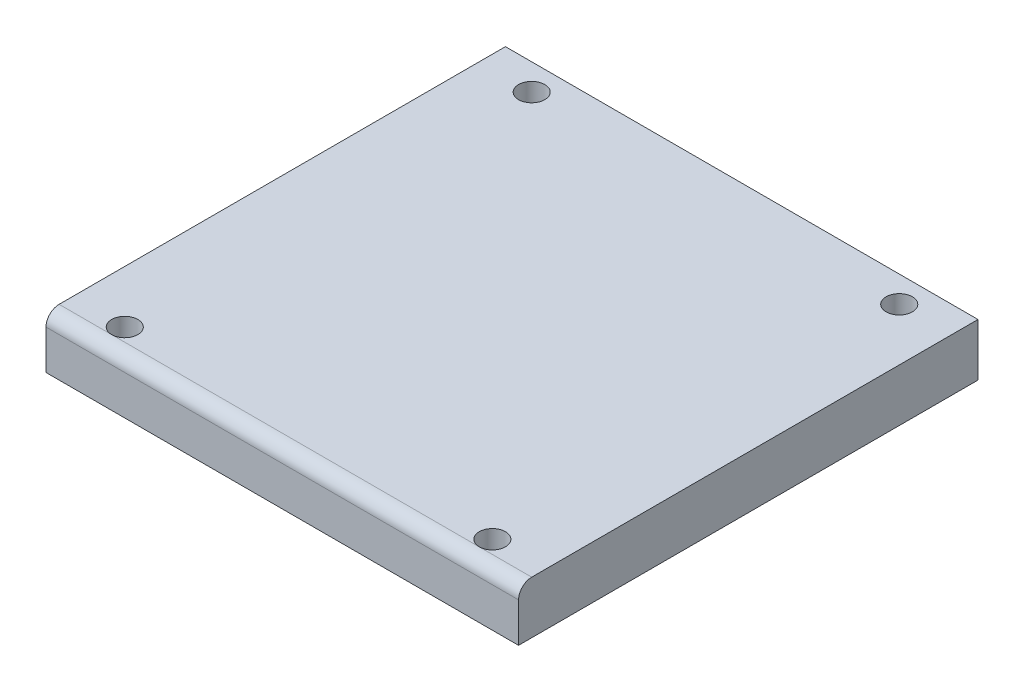
ISO-10303-21;
HEADER;
FILE_DESCRIPTION(('STEP AP214'),'2;1');
FILE_NAME('part.step','',(''),(''),'','','');
FILE_SCHEMA(('AUTOMOTIVE_DESIGN { 1 0 10303 214 1 1 1 1 }'));
ENDSEC;
DATA;
#1=APPLICATION_CONTEXT('core data for automotive mechanical design processes');
#2=APPLICATION_PROTOCOL_DEFINITION('international standard','automotive_design',2000,#1);
#3=PRODUCT_CONTEXT('',#1,'mechanical');
#4=PRODUCT('Part','Part','',(#3));
#5=PRODUCT_RELATED_PRODUCT_CATEGORY('part','',(#4));
#6=PRODUCT_DEFINITION_FORMATION('','',#4);
#7=PRODUCT_DEFINITION_CONTEXT('part definition',#1,'design');
#8=PRODUCT_DEFINITION('design','',#6,#7);
#9=PRODUCT_DEFINITION_SHAPE('','',#8);
#10=(LENGTH_UNIT() NAMED_UNIT(*) SI_UNIT(.MILLI.,.METRE.));
#11=(NAMED_UNIT(*) PLANE_ANGLE_UNIT() SI_UNIT($,.RADIAN.));
#12=(NAMED_UNIT(*) SI_UNIT($,.STERADIAN.) SOLID_ANGLE_UNIT());
#13=UNCERTAINTY_MEASURE_WITH_UNIT(LENGTH_MEASURE(1.E-05),#10,'distance_accuracy_value','');
#14=(GEOMETRIC_REPRESENTATION_CONTEXT(3) GLOBAL_UNCERTAINTY_ASSIGNED_CONTEXT((#13)) GLOBAL_UNIT_ASSIGNED_CONTEXT((#10,
#11,#12)) REPRESENTATION_CONTEXT('',''));
#15=CARTESIAN_POINT('',(0.,0.,0.));
#16=DIRECTION('',(0.,0.,1.));
#17=DIRECTION('',(1.,0.,0.));
#18=AXIS2_PLACEMENT_3D('',#15,#16,#17);
#19=CARTESIAN_POINT('',(0.,3.,0.));
#20=DIRECTION('',(0.,1.,0.));
#21=DIRECTION('',(0.,0.,1.));
#22=AXIS2_PLACEMENT_3D('',#19,#20,#21);
#23=PLANE('',#22);
#24=CARTESIAN_POINT('',(70.,3.,-77.5));
#25=DIRECTION('',(0.,1.,0.));
#26=DIRECTION('',(0.,0.,1.));
#27=AXIS2_PLACEMENT_3D('',#24,#25,#26);
#28=CIRCLE('',#27,2.75000000000001);
#29=CARTESIAN_POINT('',(70.,3.,-74.75));
#30=VERTEX_POINT('',#29);
#31=EDGE_CURVE('E159',#30,#30,#28,.F.);
#32=ORIENTED_EDGE('',*,*,#31,.T.);
#33=EDGE_LOOP('',(#32));
#34=FACE_BOUND('',#33,.T.);
#35=CARTESIAN_POINT('',(70.,3.,-77.5));
#36=DIRECTION('',(0.,1.,0.));
#37=DIRECTION('',(0.,0.,1.));
#38=AXIS2_PLACEMENT_3D('',#35,#36,#37);
#39=CIRCLE('',#38,5.00000000000001);
#40=CARTESIAN_POINT('',(70.,3.,-72.5));
#41=VERTEX_POINT('',#40);
#42=EDGE_CURVE('E140',#41,#41,#39,.T.);
#43=ORIENTED_EDGE('',*,*,#42,.T.);
#44=EDGE_LOOP('',(#43));
#45=FACE_BOUND('',#44,.T.);
#46=ADVANCED_FACE('F47',(#34,#45),#23,.T.);
#47=CARTESIAN_POINT('',(-70.,3.,77.5));
#48=DIRECTION('',(0.,1.,0.));
#49=DIRECTION('',(0.,0.,1.));
#50=AXIS2_PLACEMENT_3D('',#47,#48,#49);
#51=CIRCLE('',#50,5.00000000000001);
#52=CARTESIAN_POINT('',(-70.,3.,82.5));
#53=VERTEX_POINT('',#52);
#54=EDGE_CURVE('E145',#53,#53,#51,.F.);
#55=ORIENTED_EDGE('',*,*,#54,.F.);
#56=EDGE_LOOP('',(#55));
#57=FACE_BOUND('',#56,.T.);
#58=CARTESIAN_POINT('',(-70.,3.,77.5));
#59=DIRECTION('',(0.,1.,0.));
#60=DIRECTION('',(0.,0.,1.));
#61=AXIS2_PLACEMENT_3D('',#58,#59,#60);
#62=CIRCLE('',#61,2.75000000000001);
#63=CARTESIAN_POINT('',(-70.,3.,80.25));
#64=VERTEX_POINT('',#63);
#65=EDGE_CURVE('E164',#64,#64,#62,.T.);
#66=ORIENTED_EDGE('',*,*,#65,.F.);
#67=EDGE_LOOP('',(#66));
#68=FACE_BOUND('',#67,.T.);
#69=ADVANCED_FACE('F265',(#57,#68),#23,.T.);
#70=CARTESIAN_POINT('',(-70.,3.,-77.5));
#71=DIRECTION('',(0.,1.,0.));
#72=DIRECTION('',(0.,0.,1.));
#73=AXIS2_PLACEMENT_3D('',#70,#71,#72);
#74=CIRCLE('',#73,2.75000000000001);
#75=CARTESIAN_POINT('',(-70.,3.,-74.75));
#76=VERTEX_POINT('',#75);
#77=EDGE_CURVE('E155',#76,#76,#74,.F.);
#78=ORIENTED_EDGE('',*,*,#77,.T.);
#79=EDGE_LOOP('',(#78));
#80=FACE_BOUND('',#79,.T.);
#81=CARTESIAN_POINT('',(-70.,3.,-77.5));
#82=DIRECTION('',(0.,1.,0.));
#83=DIRECTION('',(0.,0.,1.));
#84=AXIS2_PLACEMENT_3D('',#81,#82,#83);
#85=CIRCLE('',#84,5.00000000000001);
#86=CARTESIAN_POINT('',(-70.,3.,-72.5));
#87=VERTEX_POINT('',#86);
#88=EDGE_CURVE('E136',#87,#87,#85,.T.);
#89=ORIENTED_EDGE('',*,*,#88,.T.);
#90=EDGE_LOOP('',(#89));
#91=FACE_BOUND('',#90,.T.);
#92=ADVANCED_FACE('F272',(#80,#91),#23,.T.);
#93=CARTESIAN_POINT('',(-90.,3.,0.));
#94=DIRECTION('',(-1.,0.,0.));
#95=DIRECTION('',(0.,0.,1.));
#96=AXIS2_PLACEMENT_3D('',#93,#94,#95);
#97=PLANE('',#96);
#98=DIRECTION('',(0.,-1.,0.));
#99=VECTOR('',#98,1.);
#100=CARTESIAN_POINT('',(-90.,3.,87.5000000000001));
#101=LINE('',#100,#99);
#102=CARTESIAN_POINT('',(-90.,15.,87.5000000000001));
#103=VERTEX_POINT('',#102);
#104=CARTESIAN_POINT('',(-90.,0.,87.5000000000001));
#105=VERTEX_POINT('',#104);
#106=EDGE_CURVE('E146',#103,#105,#101,.T.);
#107=ORIENTED_EDGE('',*,*,#106,.F.);
#108=CARTESIAN_POINT('',(-90.,15.,82.5));
#109=DIRECTION('',(-1.,0.,0.));
#110=DIRECTION('',(0.,0.,1.));
#111=AXIS2_PLACEMENT_3D('',#108,#109,#110);
#112=CIRCLE('',#111,5.);
#113=CARTESIAN_POINT('',(-90.,20.,82.5));
#114=VERTEX_POINT('',#113);
#115=EDGE_CURVE('E208',#103,#114,#112,.T.);
#116=ORIENTED_EDGE('',*,*,#115,.T.);
#117=DIRECTION('',(0.,0.,-1.));
#118=VECTOR('',#117,1.);
#119=CARTESIAN_POINT('',(-90.,20.,0.));
#120=LINE('',#119,#118);
#121=CARTESIAN_POINT('',(-90.,20.,-87.5));
#122=VERTEX_POINT('',#121);
#123=EDGE_CURVE('E108',#114,#122,#120,.T.);
#124=ORIENTED_EDGE('',*,*,#123,.T.);
#125=DIRECTION('',(0.,-1.,0.));
#126=VECTOR('',#125,1.);
#127=CARTESIAN_POINT('',(-90.,3.,-87.5));
#128=LINE('',#127,#126);
#129=CARTESIAN_POINT('',(-90.,0.,-87.5));
#130=VERTEX_POINT('',#129);
#131=EDGE_CURVE('E120',#122,#130,#128,.T.);
#132=ORIENTED_EDGE('',*,*,#131,.T.);
#133=DIRECTION('',(0.,0.,-1.));
#134=VECTOR('',#133,1.);
#135=CARTESIAN_POINT('',(-90.,0.,0.));
#136=LINE('',#135,#134);
#137=EDGE_CURVE('E154',#105,#130,#136,.T.);
#138=ORIENTED_EDGE('',*,*,#137,.F.);
#139=EDGE_LOOP('',(#107,#116,#124,#132,#138));
#140=FACE_BOUND('',#139,.T.);
#141=ADVANCED_FACE('F230',(#140),#97,.T.);
#142=CARTESIAN_POINT('',(0.,3.,87.5));
#143=DIRECTION('',(0.,0.,1.));
#144=DIRECTION('',(1.,0.,0.));
#145=AXIS2_PLACEMENT_3D('',#142,#143,#144);
#146=PLANE('',#145);
#147=DIRECTION('',(0.,-1.,0.));
#148=VECTOR('',#147,1.);
#149=CARTESIAN_POINT('',(90.,3.,87.5));
#150=LINE('',#149,#148);
#151=CARTESIAN_POINT('',(90.,15.,87.5));
#152=VERTEX_POINT('',#151);
#153=CARTESIAN_POINT('',(90.,0.,87.5));
#154=VERTEX_POINT('',#153);
#155=EDGE_CURVE('E119',#152,#154,#150,.T.);
#156=ORIENTED_EDGE('',*,*,#155,.F.);
#157=DIRECTION('',(-1.,0.,0.));
#158=VECTOR('',#157,1.);
#159=CARTESIAN_POINT('',(0.,15.,87.5));
#160=LINE('',#159,#158);
#161=EDGE_CURVE('E150',#152,#103,#160,.T.);
#162=ORIENTED_EDGE('',*,*,#161,.T.);
#163=ORIENTED_EDGE('',*,*,#106,.T.);
#164=DIRECTION('',(-1.,0.,0.));
#165=VECTOR('',#164,1.);
#166=CARTESIAN_POINT('',(0.,0.,87.5));
#167=LINE('',#166,#165);
#168=EDGE_CURVE('E175',#154,#105,#167,.T.);
#169=ORIENTED_EDGE('',*,*,#168,.F.);
#170=EDGE_LOOP('',(#156,#162,#163,#169));
#171=FACE_BOUND('',#170,.T.);
#172=ADVANCED_FACE('F235',(#171),#146,.T.);
#173=CARTESIAN_POINT('',(90.,3.,0.));
#174=DIRECTION('',(-1.,0.,0.));
#175=DIRECTION('',(0.,0.,1.));
#176=AXIS2_PLACEMENT_3D('',#173,#174,#175);
#177=PLANE('',#176);
#178=DIRECTION('',(0.,0.,-1.));
#179=VECTOR('',#178,1.);
#180=CARTESIAN_POINT('',(90.,20.,0.));
#181=LINE('',#180,#179);
#182=CARTESIAN_POINT('',(90.,20.,82.5));
#183=VERTEX_POINT('',#182);
#184=CARTESIAN_POINT('',(90.,20.,-87.5));
#185=VERTEX_POINT('',#184);
#186=EDGE_CURVE('E99',#183,#185,#181,.T.);
#187=ORIENTED_EDGE('',*,*,#186,.F.);
#188=CARTESIAN_POINT('',(90.,15.,82.5));
#189=DIRECTION('',(-1.,0.,0.));
#190=DIRECTION('',(0.,0.,1.));
#191=AXIS2_PLACEMENT_3D('',#188,#189,#190);
#192=CIRCLE('',#191,5.);
#193=EDGE_CURVE('E11',#183,#152,#192,.F.);
#194=ORIENTED_EDGE('',*,*,#193,.T.);
#195=ORIENTED_EDGE('',*,*,#155,.T.);
#196=DIRECTION('',(0.,0.,-1.));
#197=VECTOR('',#196,1.);
#198=CARTESIAN_POINT('',(90.,0.,0.));
#199=LINE('',#198,#197);
#200=CARTESIAN_POINT('',(90.,0.,-87.5));
#201=VERTEX_POINT('',#200);
#202=EDGE_CURVE('E114',#154,#201,#199,.T.);
#203=ORIENTED_EDGE('',*,*,#202,.T.);
#204=DIRECTION('',(0.,-1.,0.));
#205=VECTOR('',#204,1.);
#206=CARTESIAN_POINT('',(90.,3.,-87.5));
#207=LINE('',#206,#205);
#208=EDGE_CURVE('E111',#185,#201,#207,.T.);
#209=ORIENTED_EDGE('',*,*,#208,.F.);
#210=EDGE_LOOP('',(#187,#194,#195,#203,#209));
#211=FACE_BOUND('',#210,.T.);
#212=ADVANCED_FACE('F112',(#211),#177,.F.);
#213=CARTESIAN_POINT('',(-70.,3.,77.5));
#214=DIRECTION('',(0.,-1.,0.));
#215=DIRECTION('',(0.,0.,-1.));
#216=AXIS2_PLACEMENT_3D('',#213,#214,#215);
#217=CYLINDRICAL_SURFACE('',#216,2.75000000000001);
#218=ORIENTED_EDGE('',*,*,#65,.T.);
#219=EDGE_LOOP('',(#218));
#220=FACE_BOUND('',#219,.T.);
#221=CARTESIAN_POINT('',(-70.,0.,77.5));
#222=DIRECTION('',(0.,1.,0.));
#223=DIRECTION('',(0.,0.,1.));
#224=AXIS2_PLACEMENT_3D('',#221,#222,#223);
#225=CIRCLE('',#224,2.75000000000001);
#226=CARTESIAN_POINT('',(-70.,0.,80.25));
#227=VERTEX_POINT('',#226);
#228=EDGE_CURVE('E192',#227,#227,#225,.T.);
#229=ORIENTED_EDGE('',*,*,#228,.F.);
#230=EDGE_LOOP('',(#229));
#231=FACE_BOUND('',#230,.T.);
#232=ADVANCED_FACE('F252',(#220,#231),#217,.F.);
#233=CARTESIAN_POINT('',(70.,3.,-77.5));
#234=DIRECTION('',(0.,-1.,0.));
#235=DIRECTION('',(0.,0.,-1.));
#236=AXIS2_PLACEMENT_3D('',#233,#234,#235);
#237=CYLINDRICAL_SURFACE('',#236,2.75000000000001);
#238=ORIENTED_EDGE('',*,*,#31,.F.);
#239=EDGE_LOOP('',(#238));
#240=FACE_BOUND('',#239,.T.);
#241=CARTESIAN_POINT('',(70.,0.,-77.5));
#242=DIRECTION('',(0.,1.,0.));
#243=DIRECTION('',(0.,0.,1.));
#244=AXIS2_PLACEMENT_3D('',#241,#242,#243);
#245=CIRCLE('',#244,2.75000000000001);
#246=CARTESIAN_POINT('',(70.,0.,-74.75));
#247=VERTEX_POINT('',#246);
#248=EDGE_CURVE('E188',#247,#247,#245,.F.);
#249=ORIENTED_EDGE('',*,*,#248,.T.);
#250=EDGE_LOOP('',(#249));
#251=FACE_BOUND('',#250,.T.);
#252=ADVANCED_FACE('F249',(#240,#251),#237,.F.);
#253=CARTESIAN_POINT('',(-70.,3.,-77.5));
#254=DIRECTION('',(0.,-1.,0.));
#255=DIRECTION('',(0.,0.,-1.));
#256=AXIS2_PLACEMENT_3D('',#253,#254,#255);
#257=CYLINDRICAL_SURFACE('',#256,2.75000000000001);
#258=ORIENTED_EDGE('',*,*,#77,.F.);
#259=EDGE_LOOP('',(#258));
#260=FACE_BOUND('',#259,.T.);
#261=CARTESIAN_POINT('',(-70.,0.,-77.5));
#262=DIRECTION('',(0.,1.,0.));
#263=DIRECTION('',(0.,0.,1.));
#264=AXIS2_PLACEMENT_3D('',#261,#262,#263);
#265=CIRCLE('',#264,2.75000000000001);
#266=CARTESIAN_POINT('',(-70.,0.,-74.75));
#267=VERTEX_POINT('',#266);
#268=EDGE_CURVE('E184',#267,#267,#265,.F.);
#269=ORIENTED_EDGE('',*,*,#268,.T.);
#270=EDGE_LOOP('',(#269));
#271=FACE_BOUND('',#270,.T.);
#272=ADVANCED_FACE('F251',(#260,#271),#257,.F.);
#273=CARTESIAN_POINT('',(0.,3.,-87.5));
#274=DIRECTION('',(0.,0.,1.));
#275=DIRECTION('',(1.,0.,0.));
#276=AXIS2_PLACEMENT_3D('',#273,#274,#275);
#277=PLANE('',#276);
#278=DIRECTION('',(-1.,0.,0.));
#279=VECTOR('',#278,1.);
#280=CARTESIAN_POINT('',(0.,0.,-87.5));
#281=LINE('',#280,#279);
#282=EDGE_CURVE('E181',#201,#130,#281,.T.);
#283=ORIENTED_EDGE('',*,*,#282,.T.);
#284=ORIENTED_EDGE('',*,*,#131,.F.);
#285=DIRECTION('',(-1.,0.,0.));
#286=VECTOR('',#285,1.);
#287=CARTESIAN_POINT('',(0.,20.,-87.5));
#288=LINE('',#287,#286);
#289=EDGE_CURVE('E104',#185,#122,#288,.T.);
#290=ORIENTED_EDGE('',*,*,#289,.F.);
#291=ORIENTED_EDGE('',*,*,#208,.T.);
#292=EDGE_LOOP('',(#283,#284,#290,#291));
#293=FACE_BOUND('',#292,.T.);
#294=ADVANCED_FACE('F123',(#293),#277,.F.);
#295=CARTESIAN_POINT('',(70.,3.,77.5));
#296=DIRECTION('',(0.,-1.,0.));
#297=DIRECTION('',(0.,0.,-1.));
#298=AXIS2_PLACEMENT_3D('',#295,#296,#297);
#299=CYLINDRICAL_SURFACE('',#298,2.75000000000001);
#300=CARTESIAN_POINT('',(70.,3.,77.5));
#301=DIRECTION('',(0.,1.,0.));
#302=DIRECTION('',(0.,0.,1.));
#303=AXIS2_PLACEMENT_3D('',#300,#301,#302);
#304=CIRCLE('',#303,2.75000000000001);
#305=CARTESIAN_POINT('',(70.,3.,80.25));
#306=VERTEX_POINT('',#305);
#307=EDGE_CURVE('E168',#306,#306,#304,.T.);
#308=ORIENTED_EDGE('',*,*,#307,.T.);
#309=EDGE_LOOP('',(#308));
#310=FACE_BOUND('',#309,.T.);
#311=CARTESIAN_POINT('',(70.,0.,77.5));
#312=DIRECTION('',(0.,1.,0.));
#313=DIRECTION('',(0.,0.,1.));
#314=AXIS2_PLACEMENT_3D('',#311,#312,#313);
#315=CIRCLE('',#314,2.75000000000001);
#316=CARTESIAN_POINT('',(70.,0.,80.25));
#317=VERTEX_POINT('',#316);
#318=EDGE_CURVE('E160',#317,#317,#315,.T.);
#319=ORIENTED_EDGE('',*,*,#318,.F.);
#320=EDGE_LOOP('',(#319));
#321=FACE_BOUND('',#320,.T.);
#322=ADVANCED_FACE('F277',(#310,#321),#299,.F.);
#323=CARTESIAN_POINT('',(70.,3.,77.5));
#324=DIRECTION('',(0.,1.,0.));
#325=DIRECTION('',(0.,0.,1.));
#326=AXIS2_PLACEMENT_3D('',#323,#324,#325);
#327=CIRCLE('',#326,5.00000000000001);
#328=CARTESIAN_POINT('',(70.,3.,82.5));
#329=VERTEX_POINT('',#328);
#330=EDGE_CURVE('E141',#329,#329,#327,.F.);
#331=ORIENTED_EDGE('',*,*,#330,.F.);
#332=EDGE_LOOP('',(#331));
#333=FACE_BOUND('',#332,.T.);
#334=ORIENTED_EDGE('',*,*,#307,.F.);
#335=EDGE_LOOP('',(#334));
#336=FACE_BOUND('',#335,.T.);
#337=ADVANCED_FACE('F242',(#333,#336),#23,.T.);
#338=CARTESIAN_POINT('',(0.,0.,0.));
#339=DIRECTION('',(0.,1.,0.));
#340=DIRECTION('',(0.,0.,1.));
#341=AXIS2_PLACEMENT_3D('',#338,#339,#340);
#342=PLANE('',#341);
#343=ORIENTED_EDGE('',*,*,#318,.T.);
#344=EDGE_LOOP('',(#343));
#345=FACE_BOUND('',#344,.T.);
#346=ORIENTED_EDGE('',*,*,#268,.F.);
#347=EDGE_LOOP('',(#346));
#348=FACE_BOUND('',#347,.T.);
#349=ORIENTED_EDGE('',*,*,#137,.T.);
#350=ORIENTED_EDGE('',*,*,#282,.F.);
#351=ORIENTED_EDGE('',*,*,#202,.F.);
#352=ORIENTED_EDGE('',*,*,#168,.T.);
#353=EDGE_LOOP('',(#349,#350,#351,#352));
#354=FACE_BOUND('',#353,.T.);
#355=ORIENTED_EDGE('',*,*,#228,.T.);
#356=EDGE_LOOP('',(#355));
#357=FACE_BOUND('',#356,.T.);
#358=ORIENTED_EDGE('',*,*,#248,.F.);
#359=EDGE_LOOP('',(#358));
#360=FACE_BOUND('',#359,.T.);
#361=ADVANCED_FACE('F238',(#345,#348,#354,#357,#360),#342,.F.);
#362=CARTESIAN_POINT('',(70.,20.,-77.5));
#363=DIRECTION('',(0.,-1.,0.));
#364=DIRECTION('',(0.,0.,-1.));
#365=AXIS2_PLACEMENT_3D('',#362,#363,#364);
#366=CYLINDRICAL_SURFACE('',#365,5.00000000000001);
#367=ORIENTED_EDGE('',*,*,#42,.F.);
#368=EDGE_LOOP('',(#367));
#369=FACE_BOUND('',#368,.T.);
#370=CARTESIAN_POINT('',(70.,20.,-77.5));
#371=DIRECTION('',(0.,1.,0.));
#372=DIRECTION('',(0.,0.,1.));
#373=AXIS2_PLACEMENT_3D('',#370,#371,#372);
#374=CIRCLE('',#373,5.00000000000001);
#375=CARTESIAN_POINT('',(70.,20.,-72.5));
#376=VERTEX_POINT('',#375);
#377=EDGE_CURVE('E125',#376,#376,#374,.F.);
#378=ORIENTED_EDGE('',*,*,#377,.F.);
#379=EDGE_LOOP('',(#378));
#380=FACE_BOUND('',#379,.T.);
#381=ADVANCED_FACE('F241',(#369,#380),#366,.F.);
#382=CARTESIAN_POINT('',(-70.,20.,77.5));
#383=DIRECTION('',(0.,-1.,0.));
#384=DIRECTION('',(0.,0.,-1.));
#385=AXIS2_PLACEMENT_3D('',#382,#383,#384);
#386=CYLINDRICAL_SURFACE('',#385,5.00000000000001);
#387=ORIENTED_EDGE('',*,*,#54,.T.);
#388=EDGE_LOOP('',(#387));
#389=FACE_BOUND('',#388,.T.);
#390=CARTESIAN_POINT('',(-70.,20.,77.5));
#391=DIRECTION('',(0.,1.,0.));
#392=DIRECTION('',(0.,0.,1.));
#393=AXIS2_PLACEMENT_3D('',#390,#391,#392);
#394=CIRCLE('',#393,5.00000000000001);
#395=CARTESIAN_POINT('',(-70.,20.,82.5));
#396=VERTEX_POINT('',#395);
#397=EDGE_CURVE('E219',#396,#396,#394,.T.);
#398=ORIENTED_EDGE('',*,*,#397,.T.);
#399=EDGE_LOOP('',(#398));
#400=FACE_BOUND('',#399,.T.);
#401=ADVANCED_FACE('F310',(#389,#400),#386,.F.);
#402=CARTESIAN_POINT('',(70.,20.,77.5));
#403=DIRECTION('',(0.,-1.,0.));
#404=DIRECTION('',(0.,0.,-1.));
#405=AXIS2_PLACEMENT_3D('',#402,#403,#404);
#406=CYLINDRICAL_SURFACE('',#405,5.00000000000001);
#407=ORIENTED_EDGE('',*,*,#330,.T.);
#408=EDGE_LOOP('',(#407));
#409=FACE_BOUND('',#408,.T.);
#410=CARTESIAN_POINT('',(70.,20.,77.5));
#411=DIRECTION('',(0.,1.,0.));
#412=DIRECTION('',(0.,0.,1.));
#413=AXIS2_PLACEMENT_3D('',#410,#411,#412);
#414=CIRCLE('',#413,5.00000000000001);
#415=CARTESIAN_POINT('',(70.,20.,82.5));
#416=VERTEX_POINT('',#415);
#417=EDGE_CURVE('E218',#416,#416,#414,.T.);
#418=ORIENTED_EDGE('',*,*,#417,.T.);
#419=EDGE_LOOP('',(#418));
#420=FACE_BOUND('',#419,.T.);
#421=ADVANCED_FACE('F222',(#409,#420),#406,.F.);
#422=CARTESIAN_POINT('',(-70.,20.,-77.5));
#423=DIRECTION('',(0.,-1.,0.));
#424=DIRECTION('',(0.,0.,-1.));
#425=AXIS2_PLACEMENT_3D('',#422,#423,#424);
#426=CYLINDRICAL_SURFACE('',#425,5.00000000000001);
#427=ORIENTED_EDGE('',*,*,#88,.F.);
#428=EDGE_LOOP('',(#427));
#429=FACE_BOUND('',#428,.T.);
#430=CARTESIAN_POINT('',(-70.,20.,-77.5));
#431=DIRECTION('',(0.,1.,0.));
#432=DIRECTION('',(0.,0.,1.));
#433=AXIS2_PLACEMENT_3D('',#430,#431,#432);
#434=CIRCLE('',#433,5.00000000000001);
#435=CARTESIAN_POINT('',(-70.,20.,-72.5));
#436=VERTEX_POINT('',#435);
#437=EDGE_CURVE('E129',#436,#436,#434,.F.);
#438=ORIENTED_EDGE('',*,*,#437,.F.);
#439=EDGE_LOOP('',(#438));
#440=FACE_BOUND('',#439,.T.);
#441=ADVANCED_FACE('F295',(#429,#440),#426,.F.);
#442=CARTESIAN_POINT('',(0.,20.,0.));
#443=DIRECTION('',(0.,1.,0.));
#444=DIRECTION('',(0.,0.,1.));
#445=AXIS2_PLACEMENT_3D('',#442,#443,#444);
#446=PLANE('',#445);
#447=ORIENTED_EDGE('',*,*,#123,.F.);
#448=DIRECTION('',(-1.,0.,0.));
#449=VECTOR('',#448,1.);
#450=CARTESIAN_POINT('',(0.,20.,82.5));
#451=LINE('',#450,#449);
#452=EDGE_CURVE('E56',#114,#396,#451,.F.);
#453=ORIENTED_EDGE('',*,*,#452,.T.);
#454=ORIENTED_EDGE('',*,*,#397,.F.);
#455=DIRECTION('',(-1.,0.,0.));
#456=VECTOR('',#455,1.);
#457=CARTESIAN_POINT('',(0.,20.,82.5));
#458=LINE('',#457,#456);
#459=EDGE_CURVE('E213',#396,#416,#458,.F.);
#460=ORIENTED_EDGE('',*,*,#459,.T.);
#461=ORIENTED_EDGE('',*,*,#417,.F.);
#462=DIRECTION('',(-1.,0.,0.));
#463=VECTOR('',#462,1.);
#464=CARTESIAN_POINT('',(0.,20.,82.5));
#465=LINE('',#464,#463);
#466=EDGE_CURVE('E63',#416,#183,#465,.F.);
#467=ORIENTED_EDGE('',*,*,#466,.T.);
#468=ORIENTED_EDGE('',*,*,#186,.T.);
#469=ORIENTED_EDGE('',*,*,#289,.T.);
#470=EDGE_LOOP('',(#447,#453,#454,#460,#461,#467,#468,#469));
#471=FACE_BOUND('',#470,.T.);
#472=ORIENTED_EDGE('',*,*,#377,.T.);
#473=EDGE_LOOP('',(#472));
#474=FACE_BOUND('',#473,.T.);
#475=ORIENTED_EDGE('',*,*,#437,.T.);
#476=EDGE_LOOP('',(#475));
#477=FACE_BOUND('',#476,.T.);
#478=ADVANCED_FACE('F101',(#471,#474,#477),#446,.T.);
#479=CARTESIAN_POINT('',(0.,15.,82.5));
#480=DIRECTION('',(-1.,0.,0.));
#481=DIRECTION('',(0.,0.,1.));
#482=AXIS2_PLACEMENT_3D('',#479,#480,#481);
#483=CYLINDRICAL_SURFACE('',#482,5.);
#484=ORIENTED_EDGE('',*,*,#459,.F.);
#485=ORIENTED_EDGE('',*,*,#452,.F.);
#486=ORIENTED_EDGE('',*,*,#115,.F.);
#487=ORIENTED_EDGE('',*,*,#161,.F.);
#488=ORIENTED_EDGE('',*,*,#193,.F.);
#489=ORIENTED_EDGE('',*,*,#466,.F.);
#490=EDGE_LOOP('',(#484,#485,#486,#487,#488,#489));
#491=FACE_BOUND('',#490,.T.);
#492=ADVANCED_FACE('F49',(#491),#483,.T.);
#493=CLOSED_SHELL('',(#46,#69,#92,#141,#172,#212,#232,#252,#272,#294,#322,#337,#361,#381,#401,
#421,#441,#478,#492));
#494=MANIFOLD_SOLID_BREP('B2',#493);
#495=ADVANCED_BREP_SHAPE_REPRESENTATION('',(#18,#494),#14);
#496=SHAPE_DEFINITION_REPRESENTATION(#9,#495);
ENDSEC;
END-ISO-10303-21;
